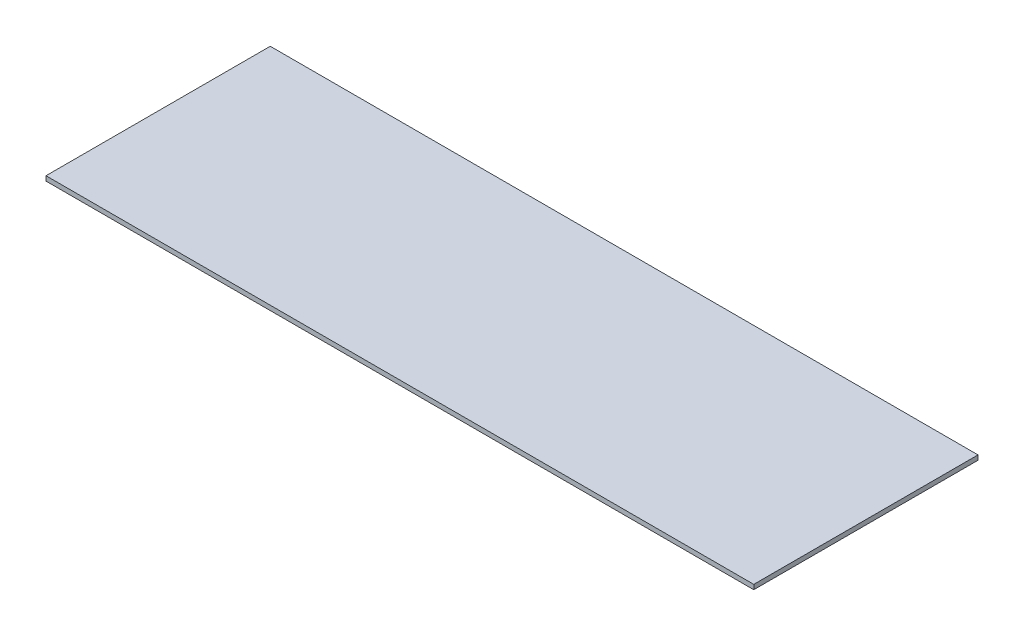
ISO-10303-21;
HEADER;
FILE_DESCRIPTION(('STEP AP214'),'2;1');
FILE_NAME('part.step','',(''),(''),'','','');
FILE_SCHEMA(('AUTOMOTIVE_DESIGN { 1 0 10303 214 1 1 1 1 }'));
ENDSEC;
DATA;
#1=APPLICATION_CONTEXT('core data for automotive mechanical design processes');
#2=APPLICATION_PROTOCOL_DEFINITION('international standard','automotive_design',2000,#1);
#3=PRODUCT_CONTEXT('',#1,'mechanical');
#4=PRODUCT('Part','Part','',(#3));
#5=PRODUCT_RELATED_PRODUCT_CATEGORY('part','',(#4));
#6=PRODUCT_DEFINITION_FORMATION('','',#4);
#7=PRODUCT_DEFINITION_CONTEXT('part definition',#1,'design');
#8=PRODUCT_DEFINITION('design','',#6,#7);
#9=PRODUCT_DEFINITION_SHAPE('','',#8);
#10=(LENGTH_UNIT() NAMED_UNIT(*) SI_UNIT(.MILLI.,.METRE.));
#11=(NAMED_UNIT(*) PLANE_ANGLE_UNIT() SI_UNIT($,.RADIAN.));
#12=(NAMED_UNIT(*) SI_UNIT($,.STERADIAN.) SOLID_ANGLE_UNIT());
#13=UNCERTAINTY_MEASURE_WITH_UNIT(LENGTH_MEASURE(1.E-05),#10,'distance_accuracy_value','');
#14=(GEOMETRIC_REPRESENTATION_CONTEXT(3) GLOBAL_UNCERTAINTY_ASSIGNED_CONTEXT((#13)) GLOBAL_UNIT_ASSIGNED_CONTEXT((#10,
#11,#12)) REPRESENTATION_CONTEXT('',''));
#15=CARTESIAN_POINT('',(0.,0.,0.));
#16=DIRECTION('',(0.,0.,1.));
#17=DIRECTION('',(1.,0.,0.));
#18=AXIS2_PLACEMENT_3D('',#15,#16,#17);
#19=CARTESIAN_POINT('',(-240.50625,3.175,76.2));
#20=DIRECTION('',(1.,0.,0.));
#21=DIRECTION('',(0.,0.,-1.));
#22=AXIS2_PLACEMENT_3D('',#19,#20,#21);
#23=PLANE('',#22);
#24=DIRECTION('',(0.,0.,1.));
#25=VECTOR('',#24,1.);
#26=CARTESIAN_POINT('',(-240.50625,0.,76.2));
#27=LINE('',#26,#25);
#28=CARTESIAN_POINT('',(-240.50625,0.,-76.2));
#29=VERTEX_POINT('',#28);
#30=CARTESIAN_POINT('',(-240.50625,0.,76.2));
#31=VERTEX_POINT('',#30);
#32=EDGE_CURVE('E107',#29,#31,#27,.T.);
#33=ORIENTED_EDGE('',*,*,#32,.T.);
#34=DIRECTION('',(0.,-1.,0.));
#35=VECTOR('',#34,1.);
#36=CARTESIAN_POINT('',(-240.50625,3.175,76.2));
#37=LINE('',#36,#35);
#38=CARTESIAN_POINT('',(-240.50625,3.175,76.2));
#39=VERTEX_POINT('',#38);
#40=EDGE_CURVE('E11',#39,#31,#37,.T.);
#41=ORIENTED_EDGE('',*,*,#40,.F.);
#42=DIRECTION('',(0.,0.,1.));
#43=VECTOR('',#42,1.);
#44=CARTESIAN_POINT('',(-240.50625,3.175,76.2));
#45=LINE('',#44,#43);
#46=CARTESIAN_POINT('',(-240.50625,3.175,-76.2));
#47=VERTEX_POINT('',#46);
#48=EDGE_CURVE('E91',#47,#39,#45,.T.);
#49=ORIENTED_EDGE('',*,*,#48,.F.);
#50=DIRECTION('',(0.,-1.,0.));
#51=VECTOR('',#50,1.);
#52=CARTESIAN_POINT('',(-240.50625,3.175,-76.2));
#53=LINE('',#52,#51);
#54=EDGE_CURVE('E103',#47,#29,#53,.T.);
#55=ORIENTED_EDGE('',*,*,#54,.T.);
#56=EDGE_LOOP('',(#33,#41,#49,#55));
#57=FACE_BOUND('',#56,.T.);
#58=ADVANCED_FACE('F39',(#57),#23,.F.);
#59=CARTESIAN_POINT('',(240.50625,3.175,76.1999999999999));
#60=DIRECTION('',(0.,0.,-1.));
#61=DIRECTION('',(-1.,0.,0.));
#62=AXIS2_PLACEMENT_3D('',#59,#60,#61);
#63=PLANE('',#62);
#64=DIRECTION('',(1.,0.,0.));
#65=VECTOR('',#64,1.);
#66=CARTESIAN_POINT('',(240.50625,0.,76.1999999999999));
#67=LINE('',#66,#65);
#68=CARTESIAN_POINT('',(240.50625,0.,76.1999999999999));
#69=VERTEX_POINT('',#68);
#70=EDGE_CURVE('E96',#31,#69,#67,.T.);
#71=ORIENTED_EDGE('',*,*,#70,.T.);
#72=DIRECTION('',(0.,-1.,0.));
#73=VECTOR('',#72,1.);
#74=CARTESIAN_POINT('',(240.50625,3.175,76.1999999999999));
#75=LINE('',#74,#73);
#76=CARTESIAN_POINT('',(240.50625,3.175,76.1999999999999));
#77=VERTEX_POINT('',#76);
#78=EDGE_CURVE('E48',#77,#69,#75,.T.);
#79=ORIENTED_EDGE('',*,*,#78,.F.);
#80=DIRECTION('',(1.,0.,0.));
#81=VECTOR('',#80,1.);
#82=CARTESIAN_POINT('',(240.50625,3.175,76.1999999999999));
#83=LINE('',#82,#81);
#84=EDGE_CURVE('E86',#39,#77,#83,.T.);
#85=ORIENTED_EDGE('',*,*,#84,.F.);
#86=ORIENTED_EDGE('',*,*,#40,.T.);
#87=EDGE_LOOP('',(#71,#79,#85,#86));
#88=FACE_BOUND('',#87,.T.);
#89=ADVANCED_FACE('F95',(#88),#63,.F.);
#90=CARTESIAN_POINT('',(240.50625,3.175,76.1999999999999));
#91=DIRECTION('',(-1.,0.,0.));
#92=DIRECTION('',(0.,0.,1.));
#93=AXIS2_PLACEMENT_3D('',#90,#91,#92);
#94=PLANE('',#93);
#95=DIRECTION('',(0.,0.,-1.));
#96=VECTOR('',#95,1.);
#97=CARTESIAN_POINT('',(240.50625,0.,76.1999999999999));
#98=LINE('',#97,#96);
#99=CARTESIAN_POINT('',(240.50625,0.,-76.2000000000001));
#100=VERTEX_POINT('',#99);
#101=EDGE_CURVE('E73',#69,#100,#98,.T.);
#102=ORIENTED_EDGE('',*,*,#101,.T.);
#103=DIRECTION('',(0.,-1.,0.));
#104=VECTOR('',#103,1.);
#105=CARTESIAN_POINT('',(240.50625,3.175,-76.2000000000001));
#106=LINE('',#105,#104);
#107=CARTESIAN_POINT('',(240.50625,3.175,-76.2000000000001));
#108=VERTEX_POINT('',#107);
#109=EDGE_CURVE('E98',#108,#100,#106,.T.);
#110=ORIENTED_EDGE('',*,*,#109,.F.);
#111=DIRECTION('',(0.,0.,-1.));
#112=VECTOR('',#111,1.);
#113=CARTESIAN_POINT('',(240.50625,3.175,76.1999999999999));
#114=LINE('',#113,#112);
#115=EDGE_CURVE('E89',#77,#108,#114,.T.);
#116=ORIENTED_EDGE('',*,*,#115,.F.);
#117=ORIENTED_EDGE('',*,*,#78,.T.);
#118=EDGE_LOOP('',(#102,#110,#116,#117));
#119=FACE_BOUND('',#118,.T.);
#120=ADVANCED_FACE('F99',(#119),#94,.F.);
#121=CARTESIAN_POINT('',(240.50625,3.175,-76.2000000000001));
#122=DIRECTION('',(0.,0.,1.));
#123=DIRECTION('',(1.,0.,0.));
#124=AXIS2_PLACEMENT_3D('',#121,#122,#123);
#125=PLANE('',#124);
#126=DIRECTION('',(-1.,0.,0.));
#127=VECTOR('',#126,1.);
#128=CARTESIAN_POINT('',(240.50625,0.,-76.2000000000001));
#129=LINE('',#128,#127);
#130=EDGE_CURVE('E79',#100,#29,#129,.T.);
#131=ORIENTED_EDGE('',*,*,#130,.T.);
#132=ORIENTED_EDGE('',*,*,#54,.F.);
#133=DIRECTION('',(-1.,0.,0.));
#134=VECTOR('',#133,1.);
#135=CARTESIAN_POINT('',(240.50625,3.175,-76.2000000000001));
#136=LINE('',#135,#134);
#137=EDGE_CURVE('E56',#108,#47,#136,.T.);
#138=ORIENTED_EDGE('',*,*,#137,.F.);
#139=ORIENTED_EDGE('',*,*,#109,.T.);
#140=EDGE_LOOP('',(#131,#132,#138,#139));
#141=FACE_BOUND('',#140,.T.);
#142=ADVANCED_FACE('F120',(#141),#125,.F.);
#143=CARTESIAN_POINT('',(0.,3.175,0.));
#144=DIRECTION('',(0.,1.,0.));
#145=DIRECTION('',(0.,0.,1.));
#146=AXIS2_PLACEMENT_3D('',#143,#144,#145);
#147=PLANE('',#146);
#148=ORIENTED_EDGE('',*,*,#48,.T.);
#149=ORIENTED_EDGE('',*,*,#84,.T.);
#150=ORIENTED_EDGE('',*,*,#115,.T.);
#151=ORIENTED_EDGE('',*,*,#137,.T.);
#152=EDGE_LOOP('',(#148,#149,#150,#151));
#153=FACE_BOUND('',#152,.T.);
#154=ADVANCED_FACE('F87',(#153),#147,.T.);
#155=CARTESIAN_POINT('',(0.,0.,0.));
#156=DIRECTION('',(0.,1.,0.));
#157=DIRECTION('',(0.,0.,1.));
#158=AXIS2_PLACEMENT_3D('',#155,#156,#157);
#159=PLANE('',#158);
#160=ORIENTED_EDGE('',*,*,#32,.F.);
#161=ORIENTED_EDGE('',*,*,#130,.F.);
#162=ORIENTED_EDGE('',*,*,#101,.F.);
#163=ORIENTED_EDGE('',*,*,#70,.F.);
#164=EDGE_LOOP('',(#160,#161,#162,#163));
#165=FACE_BOUND('',#164,.T.);
#166=ADVANCED_FACE('F123',(#165),#159,.F.);
#167=CLOSED_SHELL('',(#58,#89,#120,#142,#154,#166));
#168=MANIFOLD_SOLID_BREP('B2',#167);
#169=ADVANCED_BREP_SHAPE_REPRESENTATION('',(#18,#168),#14);
#170=SHAPE_DEFINITION_REPRESENTATION(#9,#169);
ENDSEC;
END-ISO-10303-21;
